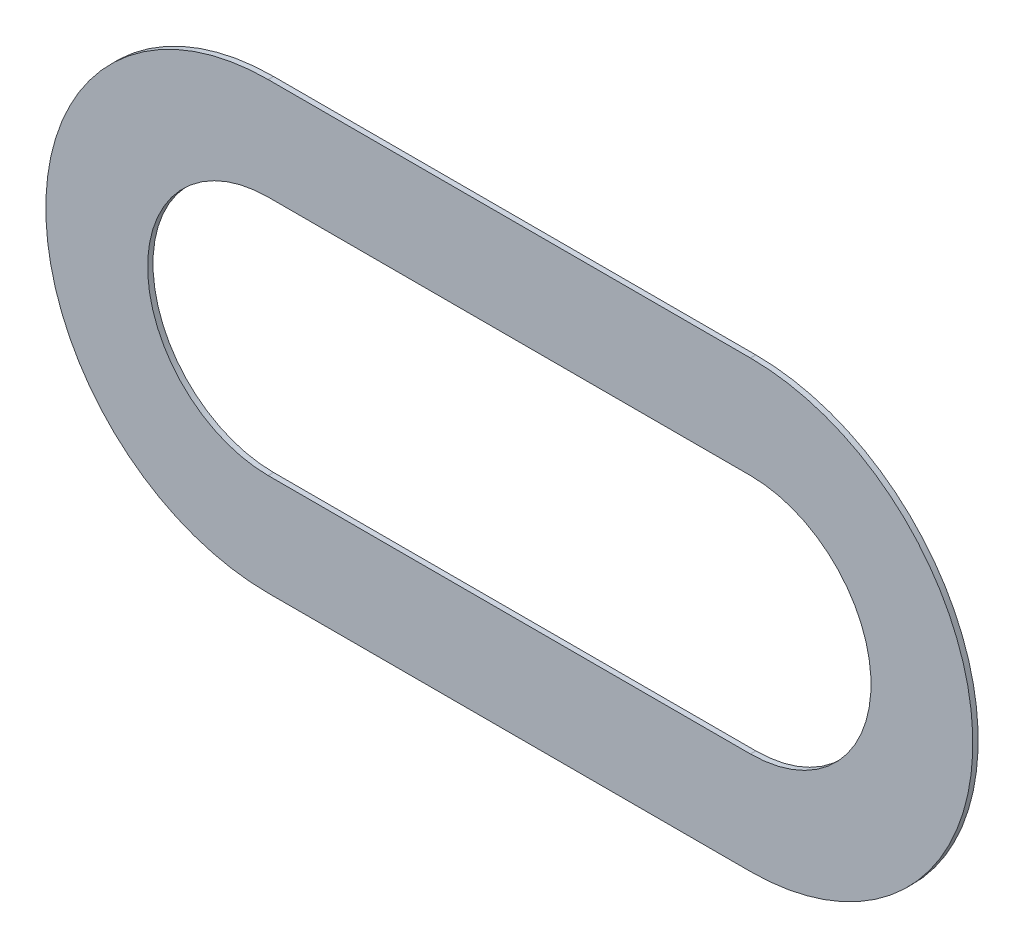
ISO-10303-21;
HEADER;
FILE_DESCRIPTION(('STEP AP214'),'2;1');
FILE_NAME('part.step','',(''),(''),'','','');
FILE_SCHEMA(('AUTOMOTIVE_DESIGN { 1 0 10303 214 1 1 1 1 }'));
ENDSEC;
DATA;
#1=APPLICATION_CONTEXT('core data for automotive mechanical design processes');
#2=APPLICATION_PROTOCOL_DEFINITION('international standard','automotive_design',2000,#1);
#3=PRODUCT_CONTEXT('',#1,'mechanical');
#4=PRODUCT('Part','Part','',(#3));
#5=PRODUCT_RELATED_PRODUCT_CATEGORY('part','',(#4));
#6=PRODUCT_DEFINITION_FORMATION('','',#4);
#7=PRODUCT_DEFINITION_CONTEXT('part definition',#1,'design');
#8=PRODUCT_DEFINITION('design','',#6,#7);
#9=PRODUCT_DEFINITION_SHAPE('','',#8);
#10=(LENGTH_UNIT() NAMED_UNIT(*) SI_UNIT(.MILLI.,.METRE.));
#11=(NAMED_UNIT(*) PLANE_ANGLE_UNIT() SI_UNIT($,.RADIAN.));
#12=(NAMED_UNIT(*) SI_UNIT($,.STERADIAN.) SOLID_ANGLE_UNIT());
#13=UNCERTAINTY_MEASURE_WITH_UNIT(LENGTH_MEASURE(1.E-05),#10,'distance_accuracy_value','');
#14=(GEOMETRIC_REPRESENTATION_CONTEXT(3) GLOBAL_UNCERTAINTY_ASSIGNED_CONTEXT((#13)) GLOBAL_UNIT_ASSIGNED_CONTEXT((#10,
#11,#12)) REPRESENTATION_CONTEXT('',''));
#15=CARTESIAN_POINT('',(0.,0.,0.));
#16=DIRECTION('',(0.,0.,1.));
#17=DIRECTION('',(1.,0.,0.));
#18=AXIS2_PLACEMENT_3D('',#15,#16,#17);
#19=CARTESIAN_POINT('',(5.860697562431,-4.,0.07615128101));
#20=DIRECTION('',(0.,0.,-1.));
#21=DIRECTION('',(-1.,0.,0.));
#22=AXIS2_PLACEMENT_3D('',#19,#20,#21);
#23=PLANE('',#22);
#24=CARTESIAN_POINT('',(5.375,-7.25,0.07615128101));
#25=DIRECTION('',(0.,0.,-1.));
#26=DIRECTION('',(-1.,0.,0.));
#27=AXIS2_PLACEMENT_3D('',#24,#25,#26);
#28=CIRCLE('',#27,0.45);
#29=CARTESIAN_POINT('',(5.375,-7.7,0.07615128101));
#30=VERTEX_POINT('',#29);
#31=CARTESIAN_POINT('',(5.375,-6.8,0.07615128101));
#32=VERTEX_POINT('',#31);
#33=EDGE_CURVE('E101',#30,#32,#28,.F.);
#34=ORIENTED_EDGE('',*,*,#33,.T.);
#35=DIRECTION('',(1.,0.,0.));
#36=VECTOR('',#35,1.);
#37=CARTESIAN_POINT('',(3.575,-6.8,0.07615128101));
#38=LINE('',#37,#36);
#39=CARTESIAN_POINT('',(3.575,-6.8,0.07615128101));
#40=VERTEX_POINT('',#39);
#41=EDGE_CURVE('E127',#40,#32,#38,.T.);
#42=ORIENTED_EDGE('',*,*,#41,.F.);
#43=CARTESIAN_POINT('',(3.575,-7.25,0.07615128101));
#44=DIRECTION('',(0.,0.,-1.));
#45=DIRECTION('',(-1.,0.,0.));
#46=AXIS2_PLACEMENT_3D('',#43,#44,#45);
#47=CIRCLE('',#46,0.45);
#48=CARTESIAN_POINT('',(3.575,-7.7,0.07615128101));
#49=VERTEX_POINT('',#48);
#50=EDGE_CURVE('E130',#40,#49,#47,.F.);
#51=ORIENTED_EDGE('',*,*,#50,.T.);
#52=DIRECTION('',(-1.,0.,0.));
#53=VECTOR('',#52,1.);
#54=CARTESIAN_POINT('',(5.375,-7.7,0.07615128101));
#55=LINE('',#54,#53);
#56=EDGE_CURVE('E132',#30,#49,#55,.T.);
#57=ORIENTED_EDGE('',*,*,#56,.F.);
#58=EDGE_LOOP('',(#34,#42,#51,#57));
#59=FACE_BOUND('',#58,.T.);
#60=DIRECTION('',(1.,0.,0.));
#61=VECTOR('',#60,1.);
#62=CARTESIAN_POINT('',(3.575,-8.08,0.07615128101));
#63=LINE('',#62,#61);
#64=CARTESIAN_POINT('',(3.575,-8.08,0.07615128101));
#65=VERTEX_POINT('',#64);
#66=CARTESIAN_POINT('',(5.375,-8.08,0.07615128101));
#67=VERTEX_POINT('',#66);
#68=EDGE_CURVE('E20',#65,#67,#63,.T.);
#69=ORIENTED_EDGE('',*,*,#68,.F.);
#70=CARTESIAN_POINT('',(3.575,-7.25,0.07615128101));
#71=DIRECTION('',(0.,0.,-1.));
#72=DIRECTION('',(-1.,0.,0.));
#73=AXIS2_PLACEMENT_3D('',#70,#71,#72);
#74=CIRCLE('',#73,0.83);
#75=CARTESIAN_POINT('',(3.575,-6.42,0.07615128101));
#76=VERTEX_POINT('',#75);
#77=EDGE_CURVE('E83',#76,#65,#74,.F.);
#78=ORIENTED_EDGE('',*,*,#77,.F.);
#79=DIRECTION('',(-1.,0.,0.));
#80=VECTOR('',#79,1.);
#81=CARTESIAN_POINT('',(5.375,-6.42,0.07615128101));
#82=LINE('',#81,#80);
#83=CARTESIAN_POINT('',(5.375,-6.42,0.07615128101));
#84=VERTEX_POINT('',#83);
#85=EDGE_CURVE('E98',#84,#76,#82,.T.);
#86=ORIENTED_EDGE('',*,*,#85,.F.);
#87=CARTESIAN_POINT('',(5.375,-7.25,0.07615128101));
#88=DIRECTION('',(0.,0.,-1.));
#89=DIRECTION('',(-1.,0.,0.));
#90=AXIS2_PLACEMENT_3D('',#87,#88,#89);
#91=CIRCLE('',#90,0.83);
#92=EDGE_CURVE('E85',#67,#84,#91,.F.);
#93=ORIENTED_EDGE('',*,*,#92,.F.);
#94=EDGE_LOOP('',(#69,#78,#86,#93));
#95=FACE_BOUND('',#94,.T.);
#96=ADVANCED_FACE('F17',(#59,#95),#23,.T.);
#97=CARTESIAN_POINT('',(3.575,-8.08,0.0762));
#98=DIRECTION('',(0.,-1.,0.));
#99=DIRECTION('',(0.,0.,-1.));
#100=AXIS2_PLACEMENT_3D('',#97,#98,#99);
#101=PLANE('',#100);
#102=DIRECTION('',(0.,0.,1.));
#103=VECTOR('',#102,1.);
#104=CARTESIAN_POINT('',(3.575,-8.08,0.0762));
#105=LINE('',#104,#103);
#106=CARTESIAN_POINT('',(3.575,-8.08,0.0962));
#107=VERTEX_POINT('',#106);
#108=EDGE_CURVE('E90',#65,#107,#105,.T.);
#109=ORIENTED_EDGE('',*,*,#108,.F.);
#110=ORIENTED_EDGE('',*,*,#68,.T.);
#111=DIRECTION('',(0.,0.,1.));
#112=VECTOR('',#111,1.);
#113=CARTESIAN_POINT('',(5.375,-8.08,0.0762));
#114=LINE('',#113,#112);
#115=CARTESIAN_POINT('',(5.375,-8.08,0.0962));
#116=VERTEX_POINT('',#115);
#117=EDGE_CURVE('E88',#116,#67,#114,.F.);
#118=ORIENTED_EDGE('',*,*,#117,.F.);
#119=DIRECTION('',(1.,0.,0.));
#120=VECTOR('',#119,1.);
#121=CARTESIAN_POINT('',(0.,-8.08,0.0962));
#122=LINE('',#121,#120);
#123=EDGE_CURVE('E93',#107,#116,#122,.T.);
#124=ORIENTED_EDGE('',*,*,#123,.F.);
#125=EDGE_LOOP('',(#109,#110,#118,#124));
#126=FACE_BOUND('',#125,.T.);
#127=ADVANCED_FACE('F91',(#126),#101,.T.);
#128=CARTESIAN_POINT('',(5.375,-7.25,0.0762));
#129=DIRECTION('',(0.,0.,1.));
#130=DIRECTION('',(1.,0.,0.));
#131=AXIS2_PLACEMENT_3D('',#128,#129,#130);
#132=CYLINDRICAL_SURFACE('',#131,0.83);
#133=ORIENTED_EDGE('',*,*,#117,.T.);
#134=ORIENTED_EDGE('',*,*,#92,.T.);
#135=DIRECTION('',(0.,0.,1.));
#136=VECTOR('',#135,1.);
#137=CARTESIAN_POINT('',(5.375,-6.42,0.0762));
#138=LINE('',#137,#136);
#139=CARTESIAN_POINT('',(5.375,-6.42,0.0962));
#140=VERTEX_POINT('',#139);
#141=EDGE_CURVE('E108',#140,#84,#138,.F.);
#142=ORIENTED_EDGE('',*,*,#141,.F.);
#143=CARTESIAN_POINT('',(5.375,-7.25,0.0962));
#144=DIRECTION('',(0.,0.,1.));
#145=DIRECTION('',(1.,0.,0.));
#146=AXIS2_PLACEMENT_3D('',#143,#144,#145);
#147=CIRCLE('',#146,0.83);
#148=EDGE_CURVE('E124',#116,#140,#147,.T.);
#149=ORIENTED_EDGE('',*,*,#148,.F.);
#150=EDGE_LOOP('',(#133,#134,#142,#149));
#151=FACE_BOUND('',#150,.T.);
#152=ADVANCED_FACE('F218',(#151),#132,.T.);
#153=CARTESIAN_POINT('',(5.375,-6.42,0.0762));
#154=DIRECTION('',(0.,1.,0.));
#155=DIRECTION('',(0.,0.,1.));
#156=AXIS2_PLACEMENT_3D('',#153,#154,#155);
#157=PLANE('',#156);
#158=ORIENTED_EDGE('',*,*,#141,.T.);
#159=ORIENTED_EDGE('',*,*,#85,.T.);
#160=DIRECTION('',(0.,0.,1.));
#161=VECTOR('',#160,1.);
#162=CARTESIAN_POINT('',(3.575,-6.42,0.0762));
#163=LINE('',#162,#161);
#164=CARTESIAN_POINT('',(3.575,-6.42,0.0962));
#165=VERTEX_POINT('',#164);
#166=EDGE_CURVE('E97',#165,#76,#163,.F.);
#167=ORIENTED_EDGE('',*,*,#166,.F.);
#168=DIRECTION('',(1.,0.,0.));
#169=VECTOR('',#168,1.);
#170=CARTESIAN_POINT('',(0.,-6.42,0.0962));
#171=LINE('',#170,#169);
#172=EDGE_CURVE('E123',#140,#165,#171,.F.);
#173=ORIENTED_EDGE('',*,*,#172,.F.);
#174=EDGE_LOOP('',(#158,#159,#167,#173));
#175=FACE_BOUND('',#174,.T.);
#176=ADVANCED_FACE('F209',(#175),#157,.T.);
#177=CARTESIAN_POINT('',(3.575,-7.25,0.0762));
#178=DIRECTION('',(0.,0.,1.));
#179=DIRECTION('',(1.,0.,0.));
#180=AXIS2_PLACEMENT_3D('',#177,#178,#179);
#181=CYLINDRICAL_SURFACE('',#180,0.83);
#182=ORIENTED_EDGE('',*,*,#166,.T.);
#183=ORIENTED_EDGE('',*,*,#77,.T.);
#184=ORIENTED_EDGE('',*,*,#108,.T.);
#185=CARTESIAN_POINT('',(3.575,-7.25,0.0962));
#186=DIRECTION('',(0.,0.,1.));
#187=DIRECTION('',(1.,0.,0.));
#188=AXIS2_PLACEMENT_3D('',#185,#186,#187);
#189=CIRCLE('',#188,0.83);
#190=EDGE_CURVE('E121',#165,#107,#189,.T.);
#191=ORIENTED_EDGE('',*,*,#190,.F.);
#192=EDGE_LOOP('',(#182,#183,#184,#191));
#193=FACE_BOUND('',#192,.T.);
#194=ADVANCED_FACE('F100',(#193),#181,.T.);
#195=CARTESIAN_POINT('',(5.375,-7.25,0.0762));
#196=DIRECTION('',(0.,0.,1.));
#197=DIRECTION('',(1.,0.,0.));
#198=AXIS2_PLACEMENT_3D('',#195,#196,#197);
#199=CYLINDRICAL_SURFACE('',#198,0.45);
#200=CARTESIAN_POINT('',(5.375,-7.25,0.0962));
#201=DIRECTION('',(0.,0.,1.));
#202=DIRECTION('',(1.,0.,0.));
#203=AXIS2_PLACEMENT_3D('',#200,#201,#202);
#204=CIRCLE('',#203,0.45);
#205=CARTESIAN_POINT('',(5.375,-6.8,0.0962));
#206=VERTEX_POINT('',#205);
#207=CARTESIAN_POINT('',(5.375,-7.7,0.0962));
#208=VERTEX_POINT('',#207);
#209=EDGE_CURVE('E118',#206,#208,#204,.F.);
#210=ORIENTED_EDGE('',*,*,#209,.F.);
#211=DIRECTION('',(0.,0.,-1.));
#212=VECTOR('',#211,1.);
#213=CARTESIAN_POINT('',(5.375,-6.8,0.0762));
#214=LINE('',#213,#212);
#215=EDGE_CURVE('E142',#32,#206,#214,.F.);
#216=ORIENTED_EDGE('',*,*,#215,.F.);
#217=ORIENTED_EDGE('',*,*,#33,.F.);
#218=DIRECTION('',(0.,0.,1.));
#219=VECTOR('',#218,1.);
#220=CARTESIAN_POINT('',(5.375,-7.7,0.0762));
#221=LINE('',#220,#219);
#222=EDGE_CURVE('E103',#208,#30,#221,.F.);
#223=ORIENTED_EDGE('',*,*,#222,.F.);
#224=EDGE_LOOP('',(#210,#216,#217,#223));
#225=FACE_BOUND('',#224,.T.);
#226=ADVANCED_FACE('F165',(#225),#199,.F.);
#227=CARTESIAN_POINT('',(5.375,-7.7,0.0762));
#228=DIRECTION('',(0.,1.,0.));
#229=DIRECTION('',(0.,0.,1.));
#230=AXIS2_PLACEMENT_3D('',#227,#228,#229);
#231=PLANE('',#230);
#232=ORIENTED_EDGE('',*,*,#222,.T.);
#233=ORIENTED_EDGE('',*,*,#56,.T.);
#234=DIRECTION('',(0.,0.,1.));
#235=VECTOR('',#234,1.);
#236=CARTESIAN_POINT('',(3.575,-7.7,0.0762));
#237=LINE('',#236,#235);
#238=CARTESIAN_POINT('',(3.575,-7.7,0.0962));
#239=VERTEX_POINT('',#238);
#240=EDGE_CURVE('E131',#49,#239,#237,.T.);
#241=ORIENTED_EDGE('',*,*,#240,.T.);
#242=DIRECTION('',(1.,0.,0.));
#243=VECTOR('',#242,1.);
#244=CARTESIAN_POINT('',(0.,-7.7,0.0962));
#245=LINE('',#244,#243);
#246=EDGE_CURVE('E117',#208,#239,#245,.F.);
#247=ORIENTED_EDGE('',*,*,#246,.F.);
#248=EDGE_LOOP('',(#232,#233,#241,#247));
#249=FACE_BOUND('',#248,.T.);
#250=ADVANCED_FACE('F153',(#249),#231,.T.);
#251=CARTESIAN_POINT('',(3.575,-7.25,0.0762));
#252=DIRECTION('',(0.,0.,1.));
#253=DIRECTION('',(1.,0.,0.));
#254=AXIS2_PLACEMENT_3D('',#251,#252,#253);
#255=CYLINDRICAL_SURFACE('',#254,0.45);
#256=CARTESIAN_POINT('',(3.575,-7.25,0.0962));
#257=DIRECTION('',(0.,0.,1.));
#258=DIRECTION('',(1.,0.,0.));
#259=AXIS2_PLACEMENT_3D('',#256,#257,#258);
#260=CIRCLE('',#259,0.45);
#261=CARTESIAN_POINT('',(3.575,-6.8,0.0962));
#262=VERTEX_POINT('',#261);
#263=EDGE_CURVE('E26',#239,#262,#260,.F.);
#264=ORIENTED_EDGE('',*,*,#263,.F.);
#265=ORIENTED_EDGE('',*,*,#240,.F.);
#266=ORIENTED_EDGE('',*,*,#50,.F.);
#267=DIRECTION('',(0.,0.,-1.));
#268=VECTOR('',#267,1.);
#269=CARTESIAN_POINT('',(3.575,-6.8,0.0762));
#270=LINE('',#269,#268);
#271=EDGE_CURVE('E35',#262,#40,#270,.T.);
#272=ORIENTED_EDGE('',*,*,#271,.F.);
#273=EDGE_LOOP('',(#264,#265,#266,#272));
#274=FACE_BOUND('',#273,.T.);
#275=ADVANCED_FACE('F154',(#274),#255,.F.);
#276=CARTESIAN_POINT('',(3.575,-6.8,0.0762));
#277=DIRECTION('',(0.,-1.,0.));
#278=DIRECTION('',(0.,0.,-1.));
#279=AXIS2_PLACEMENT_3D('',#276,#277,#278);
#280=PLANE('',#279);
#281=ORIENTED_EDGE('',*,*,#271,.T.);
#282=ORIENTED_EDGE('',*,*,#41,.T.);
#283=ORIENTED_EDGE('',*,*,#215,.T.);
#284=DIRECTION('',(1.,0.,0.));
#285=VECTOR('',#284,1.);
#286=CARTESIAN_POINT('',(0.,-6.8,0.0962));
#287=LINE('',#286,#285);
#288=EDGE_CURVE('E11',#262,#206,#287,.T.);
#289=ORIENTED_EDGE('',*,*,#288,.F.);
#290=EDGE_LOOP('',(#281,#282,#283,#289));
#291=FACE_BOUND('',#290,.T.);
#292=ADVANCED_FACE('F156',(#291),#280,.T.);
#293=CARTESIAN_POINT('',(0.,0.,0.0962));
#294=DIRECTION('',(0.,0.,1.));
#295=DIRECTION('',(1.,0.,0.));
#296=AXIS2_PLACEMENT_3D('',#293,#294,#295);
#297=PLANE('',#296);
#298=ORIENTED_EDGE('',*,*,#263,.T.);
#299=ORIENTED_EDGE('',*,*,#288,.T.);
#300=ORIENTED_EDGE('',*,*,#209,.T.);
#301=ORIENTED_EDGE('',*,*,#246,.T.);
#302=EDGE_LOOP('',(#298,#299,#300,#301));
#303=FACE_BOUND('',#302,.T.);
#304=ORIENTED_EDGE('',*,*,#172,.T.);
#305=ORIENTED_EDGE('',*,*,#190,.T.);
#306=ORIENTED_EDGE('',*,*,#123,.T.);
#307=ORIENTED_EDGE('',*,*,#148,.T.);
#308=EDGE_LOOP('',(#304,#305,#306,#307));
#309=FACE_BOUND('',#308,.T.);
#310=ADVANCED_FACE('F151',(#303,#309),#297,.T.);
#311=CLOSED_SHELL('',(#96,#127,#152,#176,#194,#226,#250,#275,#292,#310));
#312=MANIFOLD_SOLID_BREP('B1',#311);
#313=ADVANCED_BREP_SHAPE_REPRESENTATION('',(#18,#312),#14);
#314=SHAPE_DEFINITION_REPRESENTATION(#9,#313);
ENDSEC;
END-ISO-10303-21;
